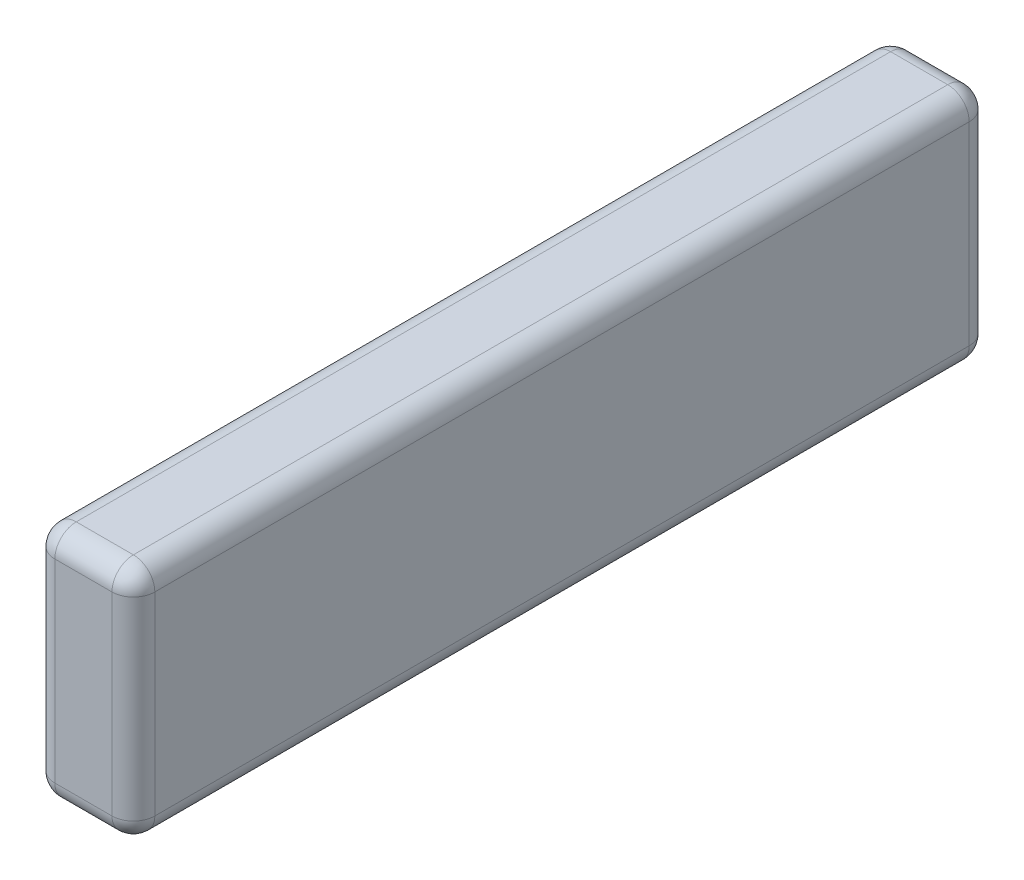
ISO-10303-21;
HEADER;
FILE_DESCRIPTION(('STEP AP214'),'2;1');
FILE_NAME('part.step','',(''),(''),'','','');
FILE_SCHEMA(('AUTOMOTIVE_DESIGN { 1 0 10303 214 1 1 1 1 }'));
ENDSEC;
DATA;
#1=APPLICATION_CONTEXT('core data for automotive mechanical design processes');
#2=APPLICATION_PROTOCOL_DEFINITION('international standard','automotive_design',2000,#1);
#3=PRODUCT_CONTEXT('',#1,'mechanical');
#4=PRODUCT('Part','Part','',(#3));
#5=PRODUCT_RELATED_PRODUCT_CATEGORY('part','',(#4));
#6=PRODUCT_DEFINITION_FORMATION('','',#4);
#7=PRODUCT_DEFINITION_CONTEXT('part definition',#1,'design');
#8=PRODUCT_DEFINITION('design','',#6,#7);
#9=PRODUCT_DEFINITION_SHAPE('','',#8);
#10=(LENGTH_UNIT() NAMED_UNIT(*) SI_UNIT(.MILLI.,.METRE.));
#11=(NAMED_UNIT(*) PLANE_ANGLE_UNIT() SI_UNIT($,.RADIAN.));
#12=(NAMED_UNIT(*) SI_UNIT($,.STERADIAN.) SOLID_ANGLE_UNIT());
#13=UNCERTAINTY_MEASURE_WITH_UNIT(LENGTH_MEASURE(1.E-05),#10,'distance_accuracy_value','');
#14=(GEOMETRIC_REPRESENTATION_CONTEXT(3) GLOBAL_UNCERTAINTY_ASSIGNED_CONTEXT((#13)) GLOBAL_UNIT_ASSIGNED_CONTEXT((#10,
#11,#12)) REPRESENTATION_CONTEXT('',''));
#15=CARTESIAN_POINT('',(0.,0.,0.));
#16=DIRECTION('',(0.,0.,1.));
#17=DIRECTION('',(1.,0.,0.));
#18=AXIS2_PLACEMENT_3D('',#15,#16,#17);
#19=CARTESIAN_POINT('',(140.,165.8,600.));
#20=DIRECTION('',(0.,0.,-1.));
#21=DIRECTION('',(-1.,0.,0.));
#22=AXIS2_PLACEMENT_3D('',#19,#20,#21);
#23=PLANE('',#22);
#24=DIRECTION('',(-1.,0.,0.));
#25=VECTOR('',#24,1.);
#26=CARTESIAN_POINT('',(140.,135.8,600.));
#27=LINE('',#26,#25);
#28=CARTESIAN_POINT('',(110.,135.8,600.));
#29=VERTEX_POINT('',#28);
#30=CARTESIAN_POINT('',(30.,135.8,600.));
#31=VERTEX_POINT('',#30);
#32=EDGE_CURVE('E181',#29,#31,#27,.T.);
#33=ORIENTED_EDGE('',*,*,#32,.T.);
#34=DIRECTION('',(0.,-1.,0.));
#35=VECTOR('',#34,1.);
#36=CARTESIAN_POINT('',(30.,-165.8,600.));
#37=LINE('',#36,#35);
#38=CARTESIAN_POINT('',(30.,-135.8,600.));
#39=VERTEX_POINT('',#38);
#40=EDGE_CURVE('E188',#31,#39,#37,.T.);
#41=ORIENTED_EDGE('',*,*,#40,.T.);
#42=DIRECTION('',(-1.,0.,0.));
#43=VECTOR('',#42,1.);
#44=CARTESIAN_POINT('',(140.,-135.8,600.));
#45=LINE('',#44,#43);
#46=CARTESIAN_POINT('',(110.,-135.8,600.));
#47=VERTEX_POINT('',#46);
#48=EDGE_CURVE('E184',#39,#47,#45,.F.);
#49=ORIENTED_EDGE('',*,*,#48,.T.);
#50=DIRECTION('',(0.,-1.,0.));
#51=VECTOR('',#50,1.);
#52=CARTESIAN_POINT('',(110.,165.8,600.));
#53=LINE('',#52,#51);
#54=EDGE_CURVE('E178',#47,#29,#53,.F.);
#55=ORIENTED_EDGE('',*,*,#54,.T.);
#56=EDGE_LOOP('',(#33,#41,#49,#55));
#57=FACE_BOUND('',#56,.T.);
#58=ADVANCED_FACE('F39',(#57),#23,.F.);
#59=CARTESIAN_POINT('',(140.,-165.8,-600.));
#60=DIRECTION('',(0.,1.,0.));
#61=DIRECTION('',(0.,0.,1.));
#62=AXIS2_PLACEMENT_3D('',#59,#60,#61);
#63=PLANE('',#62);
#64=DIRECTION('',(-1.,0.,0.));
#65=VECTOR('',#64,1.);
#66=CARTESIAN_POINT('',(140.,-165.8,570.));
#67=LINE('',#66,#65);
#68=CARTESIAN_POINT('',(110.,-165.8,570.));
#69=VERTEX_POINT('',#68);
#70=CARTESIAN_POINT('',(30.,-165.8,570.));
#71=VERTEX_POINT('',#70);
#72=EDGE_CURVE('E140',#69,#71,#67,.T.);
#73=ORIENTED_EDGE('',*,*,#72,.T.);
#74=DIRECTION('',(0.,0.,-1.));
#75=VECTOR('',#74,1.);
#76=CARTESIAN_POINT('',(30.,-165.8,-600.));
#77=LINE('',#76,#75);
#78=CARTESIAN_POINT('',(30.,-165.8,-570.));
#79=VERTEX_POINT('',#78);
#80=EDGE_CURVE('E135',#71,#79,#77,.T.);
#81=ORIENTED_EDGE('',*,*,#80,.T.);
#82=DIRECTION('',(-1.,0.,0.));
#83=VECTOR('',#82,1.);
#84=CARTESIAN_POINT('',(140.,-165.8,-570.));
#85=LINE('',#84,#83);
#86=CARTESIAN_POINT('',(110.,-165.8,-570.));
#87=VERTEX_POINT('',#86);
#88=EDGE_CURVE('E127',#79,#87,#85,.F.);
#89=ORIENTED_EDGE('',*,*,#88,.T.);
#90=DIRECTION('',(0.,0.,-1.));
#91=VECTOR('',#90,1.);
#92=CARTESIAN_POINT('',(110.,-165.8,-600.));
#93=LINE('',#92,#91);
#94=EDGE_CURVE('E132',#87,#69,#93,.F.);
#95=ORIENTED_EDGE('',*,*,#94,.T.);
#96=EDGE_LOOP('',(#73,#81,#89,#95));
#97=FACE_BOUND('',#96,.T.);
#98=ADVANCED_FACE('F130',(#97),#63,.F.);
#99=CARTESIAN_POINT('',(140.,165.8,-600.));
#100=DIRECTION('',(0.,0.,1.));
#101=DIRECTION('',(1.,0.,0.));
#102=AXIS2_PLACEMENT_3D('',#99,#100,#101);
#103=PLANE('',#102);
#104=DIRECTION('',(-1.,0.,0.));
#105=VECTOR('',#104,1.);
#106=CARTESIAN_POINT('',(140.,-135.8,-600.));
#107=LINE('',#106,#105);
#108=CARTESIAN_POINT('',(110.,-135.8,-600.));
#109=VERTEX_POINT('',#108);
#110=CARTESIAN_POINT('',(30.,-135.8,-600.));
#111=VERTEX_POINT('',#110);
#112=EDGE_CURVE('E148',#109,#111,#107,.T.);
#113=ORIENTED_EDGE('',*,*,#112,.T.);
#114=DIRECTION('',(0.,1.,0.));
#115=VECTOR('',#114,1.);
#116=CARTESIAN_POINT('',(30.,165.8,-600.));
#117=LINE('',#116,#115);
#118=CARTESIAN_POINT('',(30.,135.8,-600.));
#119=VERTEX_POINT('',#118);
#120=EDGE_CURVE('E199',#111,#119,#117,.T.);
#121=ORIENTED_EDGE('',*,*,#120,.T.);
#122=DIRECTION('',(-1.,0.,0.));
#123=VECTOR('',#122,1.);
#124=CARTESIAN_POINT('',(140.,135.8,-600.));
#125=LINE('',#124,#123);
#126=CARTESIAN_POINT('',(110.,135.8,-600.));
#127=VERTEX_POINT('',#126);
#128=EDGE_CURVE('E194',#119,#127,#125,.F.);
#129=ORIENTED_EDGE('',*,*,#128,.T.);
#130=DIRECTION('',(0.,1.,0.));
#131=VECTOR('',#130,1.);
#132=CARTESIAN_POINT('',(110.,165.8,-600.));
#133=LINE('',#132,#131);
#134=EDGE_CURVE('E191',#127,#109,#133,.F.);
#135=ORIENTED_EDGE('',*,*,#134,.T.);
#136=EDGE_LOOP('',(#113,#121,#129,#135));
#137=FACE_BOUND('',#136,.T.);
#138=ADVANCED_FACE('F378',(#137),#103,.F.);
#139=CARTESIAN_POINT('',(140.,165.8,-600.));
#140=DIRECTION('',(0.,-1.,0.));
#141=DIRECTION('',(0.,0.,-1.));
#142=AXIS2_PLACEMENT_3D('',#139,#140,#141);
#143=PLANE('',#142);
#144=DIRECTION('',(-1.,0.,0.));
#145=VECTOR('',#144,1.);
#146=CARTESIAN_POINT('',(140.,165.8,-570.));
#147=LINE('',#146,#145);
#148=CARTESIAN_POINT('',(110.,165.8,-570.));
#149=VERTEX_POINT('',#148);
#150=CARTESIAN_POINT('',(30.,165.8,-570.));
#151=VERTEX_POINT('',#150);
#152=EDGE_CURVE('E208',#149,#151,#147,.T.);
#153=ORIENTED_EDGE('',*,*,#152,.T.);
#154=DIRECTION('',(0.,0.,1.));
#155=VECTOR('',#154,1.);
#156=CARTESIAN_POINT('',(30.,165.8,600.));
#157=LINE('',#156,#155);
#158=CARTESIAN_POINT('',(30.,165.8,570.));
#159=VERTEX_POINT('',#158);
#160=EDGE_CURVE('E212',#151,#159,#157,.T.);
#161=ORIENTED_EDGE('',*,*,#160,.T.);
#162=DIRECTION('',(-1.,0.,0.));
#163=VECTOR('',#162,1.);
#164=CARTESIAN_POINT('',(140.,165.8,570.));
#165=LINE('',#164,#163);
#166=CARTESIAN_POINT('',(110.,165.8,570.));
#167=VERTEX_POINT('',#166);
#168=EDGE_CURVE('E205',#159,#167,#165,.F.);
#169=ORIENTED_EDGE('',*,*,#168,.T.);
#170=DIRECTION('',(0.,0.,1.));
#171=VECTOR('',#170,1.);
#172=CARTESIAN_POINT('',(110.,165.8,-600.));
#173=LINE('',#172,#171);
#174=EDGE_CURVE('E202',#167,#149,#173,.F.);
#175=ORIENTED_EDGE('',*,*,#174,.T.);
#176=EDGE_LOOP('',(#153,#161,#169,#175));
#177=FACE_BOUND('',#176,.T.);
#178=ADVANCED_FACE('F327',(#177),#143,.F.);
#179=CARTESIAN_POINT('',(140.,0.,0.));
#180=DIRECTION('',(-1.,0.,0.));
#181=DIRECTION('',(0.,0.,1.));
#182=AXIS2_PLACEMENT_3D('',#179,#180,#181);
#183=PLANE('',#182);
#184=DIRECTION('',(0.,1.,0.));
#185=VECTOR('',#184,1.);
#186=CARTESIAN_POINT('',(140.,0.,-570.));
#187=LINE('',#186,#185);
#188=CARTESIAN_POINT('',(140.,-135.8,-570.));
#189=VERTEX_POINT('',#188);
#190=CARTESIAN_POINT('',(140.,135.8,-570.));
#191=VERTEX_POINT('',#190);
#192=EDGE_CURVE('E49',#189,#191,#187,.T.);
#193=ORIENTED_EDGE('',*,*,#192,.T.);
#194=DIRECTION('',(0.,0.,1.));
#195=VECTOR('',#194,1.);
#196=CARTESIAN_POINT('',(140.,135.8,0.));
#197=LINE('',#196,#195);
#198=CARTESIAN_POINT('',(140.,135.8,570.));
#199=VERTEX_POINT('',#198);
#200=EDGE_CURVE('E11',#191,#199,#197,.T.);
#201=ORIENTED_EDGE('',*,*,#200,.T.);
#202=DIRECTION('',(0.,-1.,0.));
#203=VECTOR('',#202,1.);
#204=CARTESIAN_POINT('',(140.,0.,570.));
#205=LINE('',#204,#203);
#206=CARTESIAN_POINT('',(140.,-135.8,570.));
#207=VERTEX_POINT('',#206);
#208=EDGE_CURVE('E228',#199,#207,#205,.T.);
#209=ORIENTED_EDGE('',*,*,#208,.T.);
#210=DIRECTION('',(0.,0.,-1.));
#211=VECTOR('',#210,1.);
#212=CARTESIAN_POINT('',(140.,-135.8,0.));
#213=LINE('',#212,#211);
#214=EDGE_CURVE('E60',#207,#189,#213,.T.);
#215=ORIENTED_EDGE('',*,*,#214,.T.);
#216=EDGE_LOOP('',(#193,#201,#209,#215));
#217=FACE_BOUND('',#216,.T.);
#218=ADVANCED_FACE('F342',(#217),#183,.F.);
#219=CARTESIAN_POINT('',(0.,0.,0.));
#220=DIRECTION('',(-1.,0.,0.));
#221=DIRECTION('',(0.,0.,1.));
#222=AXIS2_PLACEMENT_3D('',#219,#220,#221);
#223=PLANE('',#222);
#224=DIRECTION('',(0.,1.,0.));
#225=VECTOR('',#224,1.);
#226=CARTESIAN_POINT('',(0.,-165.8,-570.));
#227=LINE('',#226,#225);
#228=CARTESIAN_POINT('',(0.,135.8,-570.));
#229=VERTEX_POINT('',#228);
#230=CARTESIAN_POINT('',(0.,-135.8,-570.));
#231=VERTEX_POINT('',#230);
#232=EDGE_CURVE('E221',#229,#231,#227,.F.);
#233=ORIENTED_EDGE('',*,*,#232,.T.);
#234=DIRECTION('',(0.,0.,-1.));
#235=VECTOR('',#234,1.);
#236=CARTESIAN_POINT('',(0.,-135.8,600.));
#237=LINE('',#236,#235);
#238=CARTESIAN_POINT('',(0.,-135.8,570.));
#239=VERTEX_POINT('',#238);
#240=EDGE_CURVE('E224',#231,#239,#237,.F.);
#241=ORIENTED_EDGE('',*,*,#240,.T.);
#242=DIRECTION('',(0.,-1.,0.));
#243=VECTOR('',#242,1.);
#244=CARTESIAN_POINT('',(0.,165.8,570.));
#245=LINE('',#244,#243);
#246=CARTESIAN_POINT('',(0.,135.8,570.));
#247=VERTEX_POINT('',#246);
#248=EDGE_CURVE('E215',#239,#247,#245,.F.);
#249=ORIENTED_EDGE('',*,*,#248,.T.);
#250=DIRECTION('',(0.,0.,1.));
#251=VECTOR('',#250,1.);
#252=CARTESIAN_POINT('',(0.,135.8,-600.));
#253=LINE('',#252,#251);
#254=EDGE_CURVE('E218',#247,#229,#253,.F.);
#255=ORIENTED_EDGE('',*,*,#254,.T.);
#256=EDGE_LOOP('',(#233,#241,#249,#255));
#257=FACE_BOUND('',#256,.T.);
#258=ADVANCED_FACE('F318',(#257),#223,.T.);
#259=CARTESIAN_POINT('',(140.,135.8,-570.));
#260=DIRECTION('',(-1.,0.,0.));
#261=DIRECTION('',(0.,0.,1.));
#262=AXIS2_PLACEMENT_3D('',#259,#260,#261);
#263=CYLINDRICAL_SURFACE('',#262,30.);
#264=CARTESIAN_POINT('',(110.,135.8,-570.));
#265=DIRECTION('',(1.,0.,0.));
#266=DIRECTION('',(0.,0.,-1.));
#267=AXIS2_PLACEMENT_3D('',#264,#265,#266);
#268=CIRCLE('',#267,30.);
#269=EDGE_CURVE('E43',#127,#149,#268,.T.);
#270=ORIENTED_EDGE('',*,*,#269,.F.);
#271=ORIENTED_EDGE('',*,*,#128,.F.);
#272=CARTESIAN_POINT('',(30.,135.8,-570.));
#273=DIRECTION('',(-1.,0.,0.));
#274=DIRECTION('',(0.,0.,1.));
#275=AXIS2_PLACEMENT_3D('',#272,#273,#274);
#276=CIRCLE('',#275,30.);
#277=EDGE_CURVE('E172',#151,#119,#276,.T.);
#278=ORIENTED_EDGE('',*,*,#277,.F.);
#279=ORIENTED_EDGE('',*,*,#152,.F.);
#280=EDGE_LOOP('',(#270,#271,#278,#279));
#281=FACE_BOUND('',#280,.T.);
#282=ADVANCED_FACE('F41',(#281),#263,.T.);
#283=CARTESIAN_POINT('',(110.,135.8,-570.));
#284=DIRECTION('',(0.,0.,1.));
#285=DIRECTION('',(1.,0.,0.));
#286=AXIS2_PLACEMENT_3D('',#283,#284,#285);
#287=SPHERICAL_SURFACE('',#286,30.);
#288=CARTESIAN_POINT('',(110.,135.8,-570.));
#289=DIRECTION('',(0.,1.,0.));
#290=DIRECTION('',(0.,0.,1.));
#291=AXIS2_PLACEMENT_3D('',#288,#289,#290);
#292=CIRCLE('',#291,30.);
#293=EDGE_CURVE('E295',#127,#191,#292,.F.);
#294=ORIENTED_EDGE('',*,*,#293,.F.);
#295=ORIENTED_EDGE('',*,*,#269,.T.);
#296=CARTESIAN_POINT('',(110.,135.8,-570.));
#297=DIRECTION('',(0.,0.,-1.));
#298=DIRECTION('',(-1.,0.,0.));
#299=AXIS2_PLACEMENT_3D('',#296,#297,#298);
#300=CIRCLE('',#299,30.);
#301=EDGE_CURVE('E298',#191,#149,#300,.F.);
#302=ORIENTED_EDGE('',*,*,#301,.F.);
#303=EDGE_LOOP('',(#294,#295,#302));
#304=FACE_BOUND('',#303,.T.);
#305=ADVANCED_FACE('F511',(#304),#287,.T.);
#306=CARTESIAN_POINT('',(30.,135.8,-570.));
#307=DIRECTION('',(0.,0.,1.));
#308=DIRECTION('',(1.,0.,0.));
#309=AXIS2_PLACEMENT_3D('',#306,#307,#308);
#310=SPHERICAL_SURFACE('',#309,30.);
#311=CARTESIAN_POINT('',(30.,135.8,-570.));
#312=DIRECTION('',(0.,0.,-1.));
#313=DIRECTION('',(-1.,0.,0.));
#314=AXIS2_PLACEMENT_3D('',#311,#312,#313);
#315=CIRCLE('',#314,30.);
#316=EDGE_CURVE('E287',#151,#229,#315,.F.);
#317=ORIENTED_EDGE('',*,*,#316,.F.);
#318=ORIENTED_EDGE('',*,*,#277,.T.);
#319=CARTESIAN_POINT('',(30.,135.8,-570.));
#320=DIRECTION('',(0.,1.,0.));
#321=DIRECTION('',(0.,0.,1.));
#322=AXIS2_PLACEMENT_3D('',#319,#320,#321);
#323=CIRCLE('',#322,30.);
#324=EDGE_CURVE('E291',#229,#119,#323,.F.);
#325=ORIENTED_EDGE('',*,*,#324,.F.);
#326=EDGE_LOOP('',(#317,#318,#325));
#327=FACE_BOUND('',#326,.T.);
#328=ADVANCED_FACE('F307',(#327),#310,.T.);
#329=CARTESIAN_POINT('',(110.,135.8,0.));
#330=DIRECTION('',(0.,0.,1.));
#331=DIRECTION('',(0.,-1.,0.));
#332=AXIS2_PLACEMENT_3D('',#329,#330,#331);
#333=CYLINDRICAL_SURFACE('',#332,30.);
#334=ORIENTED_EDGE('',*,*,#301,.T.);
#335=ORIENTED_EDGE('',*,*,#174,.F.);
#336=CARTESIAN_POINT('',(110.,135.8,570.));
#337=DIRECTION('',(0.,0.,1.));
#338=DIRECTION('',(1.,0.,0.));
#339=AXIS2_PLACEMENT_3D('',#336,#337,#338);
#340=CIRCLE('',#339,30.);
#341=EDGE_CURVE('E279',#199,#167,#340,.T.);
#342=ORIENTED_EDGE('',*,*,#341,.F.);
#343=ORIENTED_EDGE('',*,*,#200,.F.);
#344=EDGE_LOOP('',(#334,#335,#342,#343));
#345=FACE_BOUND('',#344,.T.);
#346=ADVANCED_FACE('F341',(#345),#333,.T.);
#347=CARTESIAN_POINT('',(110.,0.,-570.));
#348=DIRECTION('',(0.,1.,0.));
#349=DIRECTION('',(0.,0.,1.));
#350=AXIS2_PLACEMENT_3D('',#347,#348,#349);
#351=CYLINDRICAL_SURFACE('',#350,30.);
#352=ORIENTED_EDGE('',*,*,#293,.T.);
#353=ORIENTED_EDGE('',*,*,#192,.F.);
#354=CARTESIAN_POINT('',(110.,-135.8,-570.));
#355=DIRECTION('',(0.,-1.,0.));
#356=DIRECTION('',(1.,0.,0.));
#357=AXIS2_PLACEMENT_3D('',#354,#355,#356);
#358=CIRCLE('',#357,30.);
#359=EDGE_CURVE('E153',#109,#189,#358,.T.);
#360=ORIENTED_EDGE('',*,*,#359,.F.);
#361=ORIENTED_EDGE('',*,*,#134,.F.);
#362=EDGE_LOOP('',(#352,#353,#360,#361));
#363=FACE_BOUND('',#362,.T.);
#364=ADVANCED_FACE('F488',(#363),#351,.T.);
#365=CARTESIAN_POINT('',(140.,-135.8,-570.));
#366=DIRECTION('',(-1.,0.,0.));
#367=DIRECTION('',(0.,0.,1.));
#368=AXIS2_PLACEMENT_3D('',#365,#366,#367);
#369=CYLINDRICAL_SURFACE('',#368,30.);
#370=CARTESIAN_POINT('',(30.,-135.8,-570.));
#371=DIRECTION('',(-1.,0.,0.));
#372=DIRECTION('',(0.,0.,1.));
#373=AXIS2_PLACEMENT_3D('',#370,#371,#372);
#374=CIRCLE('',#373,30.);
#375=EDGE_CURVE('E154',#111,#79,#374,.T.);
#376=ORIENTED_EDGE('',*,*,#375,.F.);
#377=ORIENTED_EDGE('',*,*,#112,.F.);
#378=CARTESIAN_POINT('',(110.,-135.8,-570.));
#379=DIRECTION('',(1.,0.,0.));
#380=DIRECTION('',(0.,0.,-1.));
#381=AXIS2_PLACEMENT_3D('',#378,#379,#380);
#382=CIRCLE('',#381,30.);
#383=EDGE_CURVE('E144',#87,#109,#382,.T.);
#384=ORIENTED_EDGE('',*,*,#383,.F.);
#385=ORIENTED_EDGE('',*,*,#88,.F.);
#386=EDGE_LOOP('',(#376,#377,#384,#385));
#387=FACE_BOUND('',#386,.T.);
#388=ADVANCED_FACE('F146',(#387),#369,.T.);
#389=CARTESIAN_POINT('',(30.,165.8,-570.));
#390=DIRECTION('',(0.,-1.,0.));
#391=DIRECTION('',(0.,0.,-1.));
#392=AXIS2_PLACEMENT_3D('',#389,#390,#391);
#393=CYLINDRICAL_SURFACE('',#392,30.);
#394=ORIENTED_EDGE('',*,*,#324,.T.);
#395=ORIENTED_EDGE('',*,*,#120,.F.);
#396=CARTESIAN_POINT('',(30.,-135.8,-570.));
#397=DIRECTION('',(0.,-1.,0.));
#398=DIRECTION('',(0.,0.,-1.));
#399=AXIS2_PLACEMENT_3D('',#396,#397,#398);
#400=CIRCLE('',#399,30.);
#401=EDGE_CURVE('E272',#231,#111,#400,.T.);
#402=ORIENTED_EDGE('',*,*,#401,.F.);
#403=ORIENTED_EDGE('',*,*,#232,.F.);
#404=EDGE_LOOP('',(#394,#395,#402,#403));
#405=FACE_BOUND('',#404,.T.);
#406=ADVANCED_FACE('F314',(#405),#393,.T.);
#407=CARTESIAN_POINT('',(30.,135.8,-600.));
#408=DIRECTION('',(0.,0.,-1.));
#409=DIRECTION('',(0.,1.,0.));
#410=AXIS2_PLACEMENT_3D('',#407,#408,#409);
#411=CYLINDRICAL_SURFACE('',#410,30.);
#412=ORIENTED_EDGE('',*,*,#316,.T.);
#413=ORIENTED_EDGE('',*,*,#254,.F.);
#414=CARTESIAN_POINT('',(30.,135.8,570.));
#415=DIRECTION('',(0.,0.,1.));
#416=DIRECTION('',(1.,0.,0.));
#417=AXIS2_PLACEMENT_3D('',#414,#415,#416);
#418=CIRCLE('',#417,30.);
#419=EDGE_CURVE('E268',#159,#247,#418,.T.);
#420=ORIENTED_EDGE('',*,*,#419,.F.);
#421=ORIENTED_EDGE('',*,*,#160,.F.);
#422=EDGE_LOOP('',(#412,#413,#420,#421));
#423=FACE_BOUND('',#422,.T.);
#424=ADVANCED_FACE('F324',(#423),#411,.T.);
#425=CARTESIAN_POINT('',(140.,135.8,570.));
#426=DIRECTION('',(-1.,0.,0.));
#427=DIRECTION('',(0.,0.,1.));
#428=AXIS2_PLACEMENT_3D('',#425,#426,#427);
#429=CYLINDRICAL_SURFACE('',#428,30.);
#430=CARTESIAN_POINT('',(110.,135.8,570.));
#431=DIRECTION('',(1.,0.,0.));
#432=DIRECTION('',(0.,0.,-1.));
#433=AXIS2_PLACEMENT_3D('',#430,#431,#432);
#434=CIRCLE('',#433,30.);
#435=EDGE_CURVE('E283',#167,#29,#434,.T.);
#436=ORIENTED_EDGE('',*,*,#435,.F.);
#437=ORIENTED_EDGE('',*,*,#168,.F.);
#438=CARTESIAN_POINT('',(30.,135.8,570.));
#439=DIRECTION('',(-1.,0.,0.));
#440=DIRECTION('',(0.,0.,1.));
#441=AXIS2_PLACEMENT_3D('',#438,#439,#440);
#442=CIRCLE('',#441,30.);
#443=EDGE_CURVE('E264',#31,#159,#442,.T.);
#444=ORIENTED_EDGE('',*,*,#443,.F.);
#445=ORIENTED_EDGE('',*,*,#32,.F.);
#446=EDGE_LOOP('',(#436,#437,#444,#445));
#447=FACE_BOUND('',#446,.T.);
#448=ADVANCED_FACE('F332',(#447),#429,.T.);
#449=CARTESIAN_POINT('',(110.,135.8,570.));
#450=DIRECTION('',(0.,0.,1.));
#451=DIRECTION('',(1.,0.,0.));
#452=AXIS2_PLACEMENT_3D('',#449,#450,#451);
#453=SPHERICAL_SURFACE('',#452,30.);
#454=ORIENTED_EDGE('',*,*,#341,.T.);
#455=ORIENTED_EDGE('',*,*,#435,.T.);
#456=CARTESIAN_POINT('',(110.,135.8,570.));
#457=DIRECTION('',(0.,1.,0.));
#458=DIRECTION('',(0.,0.,1.));
#459=AXIS2_PLACEMENT_3D('',#456,#457,#458);
#460=CIRCLE('',#459,30.);
#461=EDGE_CURVE('E161',#199,#29,#460,.F.);
#462=ORIENTED_EDGE('',*,*,#461,.F.);
#463=EDGE_LOOP('',(#454,#455,#462));
#464=FACE_BOUND('',#463,.T.);
#465=ADVANCED_FACE('F338',(#464),#453,.T.);
#466=CARTESIAN_POINT('',(110.,-135.8,-570.));
#467=DIRECTION('',(0.,0.,1.));
#468=DIRECTION('',(1.,0.,0.));
#469=AXIS2_PLACEMENT_3D('',#466,#467,#468);
#470=SPHERICAL_SURFACE('',#469,30.);
#471=ORIENTED_EDGE('',*,*,#383,.T.);
#472=ORIENTED_EDGE('',*,*,#359,.T.);
#473=CARTESIAN_POINT('',(110.,-135.8,-570.));
#474=DIRECTION('',(0.,0.,-1.));
#475=DIRECTION('',(-1.,0.,0.));
#476=AXIS2_PLACEMENT_3D('',#473,#474,#475);
#477=CIRCLE('',#476,30.);
#478=EDGE_CURVE('E157',#87,#189,#477,.F.);
#479=ORIENTED_EDGE('',*,*,#478,.F.);
#480=EDGE_LOOP('',(#471,#472,#479));
#481=FACE_BOUND('',#480,.T.);
#482=ADVANCED_FACE('F158',(#481),#470,.T.);
#483=CARTESIAN_POINT('',(30.,-135.8,-570.));
#484=DIRECTION('',(0.,0.,1.));
#485=DIRECTION('',(1.,0.,0.));
#486=AXIS2_PLACEMENT_3D('',#483,#484,#485);
#487=SPHERICAL_SURFACE('',#486,30.);
#488=ORIENTED_EDGE('',*,*,#401,.T.);
#489=ORIENTED_EDGE('',*,*,#375,.T.);
#490=CARTESIAN_POINT('',(30.,-135.8,-570.));
#491=DIRECTION('',(0.,0.,-1.));
#492=DIRECTION('',(-1.,0.,0.));
#493=AXIS2_PLACEMENT_3D('',#490,#491,#492);
#494=CIRCLE('',#493,30.);
#495=EDGE_CURVE('E162',#231,#79,#494,.F.);
#496=ORIENTED_EDGE('',*,*,#495,.F.);
#497=EDGE_LOOP('',(#488,#489,#496));
#498=FACE_BOUND('',#497,.T.);
#499=ADVANCED_FACE('F361',(#498),#487,.T.);
#500=CARTESIAN_POINT('',(30.,135.8,570.));
#501=DIRECTION('',(0.,0.,1.));
#502=DIRECTION('',(1.,0.,0.));
#503=AXIS2_PLACEMENT_3D('',#500,#501,#502);
#504=SPHERICAL_SURFACE('',#503,30.);
#505=ORIENTED_EDGE('',*,*,#443,.T.);
#506=ORIENTED_EDGE('',*,*,#419,.T.);
#507=CARTESIAN_POINT('',(30.,135.8,570.));
#508=DIRECTION('',(0.,1.,0.));
#509=DIRECTION('',(0.,0.,1.));
#510=AXIS2_PLACEMENT_3D('',#507,#508,#509);
#511=CIRCLE('',#510,30.);
#512=EDGE_CURVE('E254',#31,#247,#511,.F.);
#513=ORIENTED_EDGE('',*,*,#512,.F.);
#514=EDGE_LOOP('',(#505,#506,#513));
#515=FACE_BOUND('',#514,.T.);
#516=ADVANCED_FACE('F363',(#515),#504,.T.);
#517=CARTESIAN_POINT('',(110.,0.,570.));
#518=DIRECTION('',(0.,-1.,0.));
#519=DIRECTION('',(0.,0.,-1.));
#520=AXIS2_PLACEMENT_3D('',#517,#518,#519);
#521=CYLINDRICAL_SURFACE('',#520,30.);
#522=ORIENTED_EDGE('',*,*,#461,.T.);
#523=ORIENTED_EDGE('',*,*,#54,.F.);
#524=CARTESIAN_POINT('',(110.,-135.8,570.));
#525=DIRECTION('',(0.,-1.,0.));
#526=DIRECTION('',(0.,0.,-1.));
#527=AXIS2_PLACEMENT_3D('',#524,#525,#526);
#528=CIRCLE('',#527,30.);
#529=EDGE_CURVE('E250',#207,#47,#528,.T.);
#530=ORIENTED_EDGE('',*,*,#529,.F.);
#531=ORIENTED_EDGE('',*,*,#208,.F.);
#532=EDGE_LOOP('',(#522,#523,#530,#531));
#533=FACE_BOUND('',#532,.T.);
#534=ADVANCED_FACE('F346',(#533),#521,.T.);
#535=CARTESIAN_POINT('',(110.,-135.8,0.));
#536=DIRECTION('',(0.,0.,-1.));
#537=DIRECTION('',(0.,1.,0.));
#538=AXIS2_PLACEMENT_3D('',#535,#536,#537);
#539=CYLINDRICAL_SURFACE('',#538,30.);
#540=ORIENTED_EDGE('',*,*,#478,.T.);
#541=ORIENTED_EDGE('',*,*,#214,.F.);
#542=CARTESIAN_POINT('',(110.,-135.8,570.));
#543=DIRECTION('',(0.,0.,1.));
#544=DIRECTION('',(1.,0.,0.));
#545=AXIS2_PLACEMENT_3D('',#542,#543,#544);
#546=CIRCLE('',#545,30.);
#547=EDGE_CURVE('E166',#69,#207,#546,.T.);
#548=ORIENTED_EDGE('',*,*,#547,.F.);
#549=ORIENTED_EDGE('',*,*,#94,.F.);
#550=EDGE_LOOP('',(#540,#541,#548,#549));
#551=FACE_BOUND('',#550,.T.);
#552=ADVANCED_FACE('F164',(#551),#539,.T.);
#553=CARTESIAN_POINT('',(30.,-135.8,-600.));
#554=DIRECTION('',(0.,0.,1.));
#555=DIRECTION('',(0.,-1.,0.));
#556=AXIS2_PLACEMENT_3D('',#553,#554,#555);
#557=CYLINDRICAL_SURFACE('',#556,30.);
#558=ORIENTED_EDGE('',*,*,#495,.T.);
#559=ORIENTED_EDGE('',*,*,#80,.F.);
#560=CARTESIAN_POINT('',(30.,-135.8,570.));
#561=DIRECTION('',(0.,0.,1.));
#562=DIRECTION('',(1.,0.,0.));
#563=AXIS2_PLACEMENT_3D('',#560,#561,#562);
#564=CIRCLE('',#563,30.);
#565=EDGE_CURVE('E244',#239,#71,#564,.T.);
#566=ORIENTED_EDGE('',*,*,#565,.F.);
#567=ORIENTED_EDGE('',*,*,#240,.F.);
#568=EDGE_LOOP('',(#558,#559,#566,#567));
#569=FACE_BOUND('',#568,.T.);
#570=ADVANCED_FACE('F359',(#569),#557,.T.);
#571=CARTESIAN_POINT('',(30.,165.8,570.));
#572=DIRECTION('',(0.,1.,0.));
#573=DIRECTION('',(0.,0.,1.));
#574=AXIS2_PLACEMENT_3D('',#571,#572,#573);
#575=CYLINDRICAL_SURFACE('',#574,30.);
#576=ORIENTED_EDGE('',*,*,#512,.T.);
#577=ORIENTED_EDGE('',*,*,#248,.F.);
#578=CARTESIAN_POINT('',(30.,-135.8,570.));
#579=DIRECTION('',(0.,-1.,0.));
#580=DIRECTION('',(0.,0.,-1.));
#581=AXIS2_PLACEMENT_3D('',#578,#579,#580);
#582=CIRCLE('',#581,30.);
#583=EDGE_CURVE('E241',#39,#239,#582,.T.);
#584=ORIENTED_EDGE('',*,*,#583,.F.);
#585=ORIENTED_EDGE('',*,*,#40,.F.);
#586=EDGE_LOOP('',(#576,#577,#584,#585));
#587=FACE_BOUND('',#586,.T.);
#588=ADVANCED_FACE('F388',(#587),#575,.T.);
#589=CARTESIAN_POINT('',(110.,-135.8,570.));
#590=DIRECTION('',(0.,0.,1.));
#591=DIRECTION('',(1.,0.,0.));
#592=AXIS2_PLACEMENT_3D('',#589,#590,#591);
#593=SPHERICAL_SURFACE('',#592,30.);
#594=ORIENTED_EDGE('',*,*,#547,.T.);
#595=ORIENTED_EDGE('',*,*,#529,.T.);
#596=CARTESIAN_POINT('',(110.,-135.8,570.));
#597=DIRECTION('',(1.,0.,0.));
#598=DIRECTION('',(0.,0.,-1.));
#599=AXIS2_PLACEMENT_3D('',#596,#597,#598);
#600=CIRCLE('',#599,30.);
#601=EDGE_CURVE('E238',#69,#47,#600,.F.);
#602=ORIENTED_EDGE('',*,*,#601,.F.);
#603=EDGE_LOOP('',(#594,#595,#602));
#604=FACE_BOUND('',#603,.T.);
#605=ADVANCED_FACE('F348',(#604),#593,.T.);
#606=CARTESIAN_POINT('',(30.,-135.8,570.));
#607=DIRECTION('',(0.,0.,1.));
#608=DIRECTION('',(1.,0.,0.));
#609=AXIS2_PLACEMENT_3D('',#606,#607,#608);
#610=SPHERICAL_SURFACE('',#609,30.);
#611=ORIENTED_EDGE('',*,*,#583,.T.);
#612=ORIENTED_EDGE('',*,*,#565,.T.);
#613=CARTESIAN_POINT('',(30.,-135.8,570.));
#614=DIRECTION('',(-1.,0.,0.));
#615=DIRECTION('',(0.,0.,1.));
#616=AXIS2_PLACEMENT_3D('',#613,#614,#615);
#617=CIRCLE('',#616,30.);
#618=EDGE_CURVE('E235',#39,#71,#617,.F.);
#619=ORIENTED_EDGE('',*,*,#618,.F.);
#620=EDGE_LOOP('',(#611,#612,#619));
#621=FACE_BOUND('',#620,.T.);
#622=ADVANCED_FACE('F356',(#621),#610,.T.);
#623=CARTESIAN_POINT('',(140.,-135.8,570.));
#624=DIRECTION('',(-1.,0.,0.));
#625=DIRECTION('',(0.,0.,1.));
#626=AXIS2_PLACEMENT_3D('',#623,#624,#625);
#627=CYLINDRICAL_SURFACE('',#626,30.);
#628=ORIENTED_EDGE('',*,*,#601,.T.);
#629=ORIENTED_EDGE('',*,*,#48,.F.);
#630=ORIENTED_EDGE('',*,*,#618,.T.);
#631=ORIENTED_EDGE('',*,*,#72,.F.);
#632=EDGE_LOOP('',(#628,#629,#630,#631));
#633=FACE_BOUND('',#632,.T.);
#634=ADVANCED_FACE('F352',(#633),#627,.T.);
#635=CLOSED_SHELL('',(#58,#98,#138,#178,#218,#258,#282,#305,#328,#346,#364,#388,#406,#424,#448,
#465,#482,#499,#516,#534,#552,#570,#588,#605,#622,#634));
#636=MANIFOLD_SOLID_BREP('B2',#635);
#637=ADVANCED_BREP_SHAPE_REPRESENTATION('',(#18,#636),#14);
#638=SHAPE_DEFINITION_REPRESENTATION(#9,#637);
ENDSEC;
END-ISO-10303-21;
